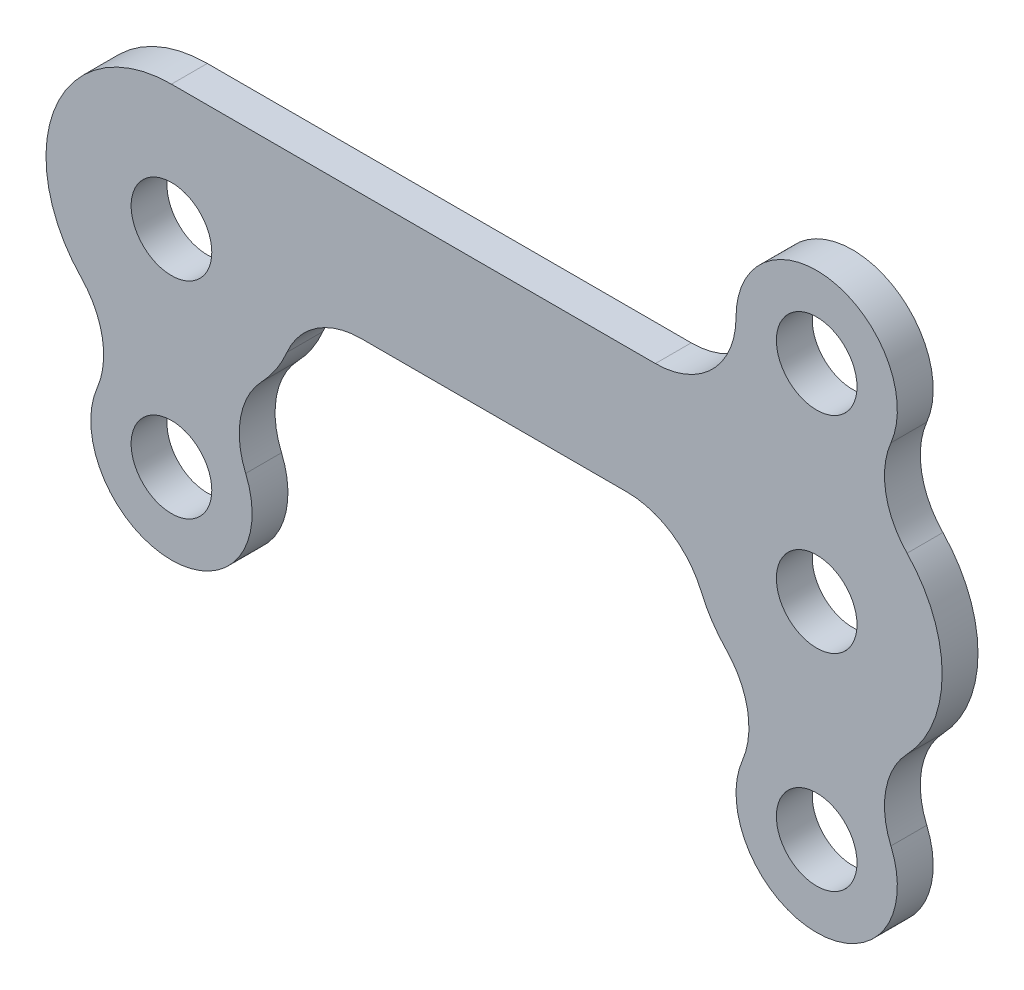
ISO-10303-21;
HEADER;
FILE_DESCRIPTION(('STEP AP214'),'2;1');
FILE_NAME('part.step','',(''),(''),'','','');
FILE_SCHEMA(('AUTOMOTIVE_DESIGN { 1 0 10303 214 1 1 1 1 }'));
ENDSEC;
DATA;
#1=APPLICATION_CONTEXT('core data for automotive mechanical design processes');
#2=APPLICATION_PROTOCOL_DEFINITION('international standard','automotive_design',2000,#1);
#3=PRODUCT_CONTEXT('',#1,'mechanical');
#4=PRODUCT('Part','Part','',(#3));
#5=PRODUCT_RELATED_PRODUCT_CATEGORY('part','',(#4));
#6=PRODUCT_DEFINITION_FORMATION('','',#4);
#7=PRODUCT_DEFINITION_CONTEXT('part definition',#1,'design');
#8=PRODUCT_DEFINITION('design','',#6,#7);
#9=PRODUCT_DEFINITION_SHAPE('','',#8);
#10=(LENGTH_UNIT() NAMED_UNIT(*) SI_UNIT(.MILLI.,.METRE.));
#11=(NAMED_UNIT(*) PLANE_ANGLE_UNIT() SI_UNIT($,.RADIAN.));
#12=(NAMED_UNIT(*) SI_UNIT($,.STERADIAN.) SOLID_ANGLE_UNIT());
#13=UNCERTAINTY_MEASURE_WITH_UNIT(LENGTH_MEASURE(1.E-05),#10,'distance_accuracy_value','');
#14=(GEOMETRIC_REPRESENTATION_CONTEXT(3) GLOBAL_UNCERTAINTY_ASSIGNED_CONTEXT((#13)) GLOBAL_UNIT_ASSIGNED_CONTEXT((#10,
#11,#12)) REPRESENTATION_CONTEXT('',''));
#15=CARTESIAN_POINT('',(0.,0.,0.));
#16=DIRECTION('',(0.,0.,1.));
#17=DIRECTION('',(1.,0.,0.));
#18=AXIS2_PLACEMENT_3D('',#15,#16,#17);
#19=CARTESIAN_POINT('',(35.149116844667,6.33274456521739,1.5875));
#20=DIRECTION('',(0.,0.,-1.));
#21=DIRECTION('',(-1.,0.,0.));
#22=AXIS2_PLACEMENT_3D('',#19,#20,#21);
#23=CYLINDRICAL_SURFACE('',#22,3.571875);
#24=CARTESIAN_POINT('',(35.149116844667,6.33274456521739,0.));
#25=DIRECTION('',(0.,0.,1.));
#26=DIRECTION('',(1.,0.,0.));
#27=AXIS2_PLACEMENT_3D('',#24,#25,#26);
#28=CIRCLE('',#27,3.571875);
#29=CARTESIAN_POINT('',(31.8620584223335,7.73043478260869,0.));
#30=VERTEX_POINT('',#29);
#31=CARTESIAN_POINT('',(32.5766363402321,3.8547140831758,0.));
#32=VERTEX_POINT('',#31);
#33=EDGE_CURVE('E159',#30,#32,#28,.T.);
#34=ORIENTED_EDGE('',*,*,#33,.F.);
#35=DIRECTION('',(0.,0.,-1.));
#36=VECTOR('',#35,1.);
#37=CARTESIAN_POINT('',(31.8620584223335,7.73043478260869,1.5875));
#38=LINE('',#37,#36);
#39=CARTESIAN_POINT('',(31.8620584223335,7.73043478260869,1.5875));
#40=VERTEX_POINT('',#39);
#41=EDGE_CURVE('E154',#40,#30,#38,.T.);
#42=ORIENTED_EDGE('',*,*,#41,.F.);
#43=CARTESIAN_POINT('',(35.149116844667,6.33274456521739,1.5875));
#44=DIRECTION('',(0.,0.,1.));
#45=DIRECTION('',(1.,0.,0.));
#46=AXIS2_PLACEMENT_3D('',#43,#44,#45);
#47=CIRCLE('',#46,3.571875);
#48=CARTESIAN_POINT('',(32.5766363402321,3.8547140831758,1.5875));
#49=VERTEX_POINT('',#48);
#50=EDGE_CURVE('E157',#40,#49,#47,.T.);
#51=ORIENTED_EDGE('',*,*,#50,.T.);
#52=DIRECTION('',(0.,0.,-1.));
#53=VECTOR('',#52,1.);
#54=CARTESIAN_POINT('',(32.5766363402321,3.8547140831758,1.5875));
#55=LINE('',#54,#53);
#56=EDGE_CURVE('E229',#49,#32,#55,.T.);
#57=ORIENTED_EDGE('',*,*,#56,.T.);
#58=EDGE_LOOP('',(#34,#42,#51,#57));
#59=FACE_BOUND('',#58,.T.);
#60=ADVANCED_FACE('F35',(#59),#23,.F.);
#61=CARTESIAN_POINT('',(28.575,9.128125,1.5875));
#62=DIRECTION('',(0.,0.,-1.));
#63=DIRECTION('',(-1.,0.,0.));
#64=AXIS2_PLACEMENT_3D('',#61,#62,#63);
#65=CYLINDRICAL_SURFACE('',#64,3.571875);
#66=CARTESIAN_POINT('',(28.575,9.128125,0.));
#67=DIRECTION('',(0.,0.,1.));
#68=DIRECTION('',(1.,0.,0.));
#69=AXIS2_PLACEMENT_3D('',#66,#67,#68);
#70=CIRCLE('',#69,3.571875);
#71=CARTESIAN_POINT('',(25.003125,9.128125,0.));
#72=VERTEX_POINT('',#71);
#73=EDGE_CURVE('E231',#30,#72,#70,.T.);
#74=ORIENTED_EDGE('',*,*,#73,.T.);
#75=DIRECTION('',(0.,0.,-1.));
#76=VECTOR('',#75,1.);
#77=CARTESIAN_POINT('',(25.003125,9.128125,1.5875));
#78=LINE('',#77,#76);
#79=CARTESIAN_POINT('',(25.003125,9.128125,1.5875));
#80=VERTEX_POINT('',#79);
#81=EDGE_CURVE('E164',#80,#72,#78,.T.);
#82=ORIENTED_EDGE('',*,*,#81,.F.);
#83=CARTESIAN_POINT('',(28.575,9.128125,1.5875));
#84=DIRECTION('',(0.,0.,1.));
#85=DIRECTION('',(1.,0.,0.));
#86=AXIS2_PLACEMENT_3D('',#83,#84,#85);
#87=CIRCLE('',#86,3.571875);
#88=EDGE_CURVE('E167',#40,#80,#87,.T.);
#89=ORIENTED_EDGE('',*,*,#88,.F.);
#90=ORIENTED_EDGE('',*,*,#41,.T.);
#91=EDGE_LOOP('',(#74,#82,#89,#90));
#92=FACE_BOUND('',#91,.T.);
#93=ADVANCED_FACE('F168',(#92),#65,.T.);
#94=CARTESIAN_POINT('',(21.43125,9.128125,1.5875));
#95=DIRECTION('',(0.,0.,-1.));
#96=DIRECTION('',(-1.,0.,0.));
#97=AXIS2_PLACEMENT_3D('',#94,#95,#96);
#98=CYLINDRICAL_SURFACE('',#97,3.571875);
#99=CARTESIAN_POINT('',(21.43125,9.128125,0.));
#100=DIRECTION('',(0.,0.,1.));
#101=DIRECTION('',(1.,0.,0.));
#102=AXIS2_PLACEMENT_3D('',#99,#100,#101);
#103=CIRCLE('',#102,3.571875);
#104=CARTESIAN_POINT('',(21.43125,5.55625,0.));
#105=VERTEX_POINT('',#104);
#106=EDGE_CURVE('E233',#105,#72,#103,.T.);
#107=ORIENTED_EDGE('',*,*,#106,.F.);
#108=DIRECTION('',(0.,0.,-1.));
#109=VECTOR('',#108,1.);
#110=CARTESIAN_POINT('',(21.43125,5.55625,1.5875));
#111=LINE('',#110,#109);
#112=CARTESIAN_POINT('',(21.43125,5.55625,1.5875));
#113=VERTEX_POINT('',#112);
#114=EDGE_CURVE('E298',#113,#105,#111,.T.);
#115=ORIENTED_EDGE('',*,*,#114,.F.);
#116=CARTESIAN_POINT('',(21.43125,9.128125,1.5875));
#117=DIRECTION('',(0.,0.,1.));
#118=DIRECTION('',(1.,0.,0.));
#119=AXIS2_PLACEMENT_3D('',#116,#117,#118);
#120=CIRCLE('',#119,3.571875);
#121=EDGE_CURVE('E172',#113,#80,#120,.T.);
#122=ORIENTED_EDGE('',*,*,#121,.T.);
#123=ORIENTED_EDGE('',*,*,#81,.T.);
#124=EDGE_LOOP('',(#107,#115,#122,#123));
#125=FACE_BOUND('',#124,.T.);
#126=ADVANCED_FACE('F356',(#125),#98,.F.);
#127=CARTESIAN_POINT('',(0.,5.55625,1.5875));
#128=DIRECTION('',(0.,1.,0.));
#129=DIRECTION('',(0.,0.,1.));
#130=AXIS2_PLACEMENT_3D('',#127,#128,#129);
#131=PLANE('',#130);
#132=DIRECTION('',(1.,0.,0.));
#133=VECTOR('',#132,1.);
#134=CARTESIAN_POINT('',(0.,5.55625,0.));
#135=LINE('',#134,#133);
#136=CARTESIAN_POINT('',(0.,5.55625,0.));
#137=VERTEX_POINT('',#136);
#138=EDGE_CURVE('E236',#137,#105,#135,.T.);
#139=ORIENTED_EDGE('',*,*,#138,.F.);
#140=DIRECTION('',(0.,0.,-1.));
#141=VECTOR('',#140,1.);
#142=CARTESIAN_POINT('',(0.,5.55625,1.5875));
#143=LINE('',#142,#141);
#144=CARTESIAN_POINT('',(0.,5.55625,1.5875));
#145=VERTEX_POINT('',#144);
#146=EDGE_CURVE('E296',#145,#137,#143,.T.);
#147=ORIENTED_EDGE('',*,*,#146,.F.);
#148=DIRECTION('',(1.,0.,0.));
#149=VECTOR('',#148,1.);
#150=CARTESIAN_POINT('',(0.,5.55625,1.5875));
#151=LINE('',#150,#149);
#152=EDGE_CURVE('E187',#145,#113,#151,.T.);
#153=ORIENTED_EDGE('',*,*,#152,.T.);
#154=ORIENTED_EDGE('',*,*,#114,.T.);
#155=EDGE_LOOP('',(#139,#147,#153,#154));
#156=FACE_BOUND('',#155,.T.);
#157=ADVANCED_FACE('F352',(#156),#131,.T.);
#158=CARTESIAN_POINT('',(0.,0.,1.5875));
#159=DIRECTION('',(0.,0.,-1.));
#160=DIRECTION('',(-1.,0.,0.));
#161=AXIS2_PLACEMENT_3D('',#158,#159,#160);
#162=CYLINDRICAL_SURFACE('',#161,5.55625);
#163=CARTESIAN_POINT('',(0.,0.,0.));
#164=DIRECTION('',(0.,0.,1.));
#165=DIRECTION('',(1.,0.,0.));
#166=AXIS2_PLACEMENT_3D('',#163,#164,#165);
#167=CIRCLE('',#166,5.55625);
#168=CARTESIAN_POINT('',(-4.0016363402321,-3.8547140831758,0.));
#169=VERTEX_POINT('',#168);
#170=EDGE_CURVE('E239',#137,#169,#167,.T.);
#171=ORIENTED_EDGE('',*,*,#170,.T.);
#172=DIRECTION('',(0.,0.,-1.));
#173=VECTOR('',#172,1.);
#174=CARTESIAN_POINT('',(-4.0016363402321,-3.8547140831758,1.5875));
#175=LINE('',#174,#173);
#176=CARTESIAN_POINT('',(-4.0016363402321,-3.8547140831758,1.5875));
#177=VERTEX_POINT('',#176);
#178=EDGE_CURVE('E294',#177,#169,#175,.T.);
#179=ORIENTED_EDGE('',*,*,#178,.F.);
#180=CARTESIAN_POINT('',(0.,0.,1.5875));
#181=DIRECTION('',(0.,0.,1.));
#182=DIRECTION('',(1.,0.,0.));
#183=AXIS2_PLACEMENT_3D('',#180,#181,#182);
#184=CIRCLE('',#183,5.55625);
#185=EDGE_CURVE('E190',#145,#177,#184,.T.);
#186=ORIENTED_EDGE('',*,*,#185,.F.);
#187=ORIENTED_EDGE('',*,*,#146,.T.);
#188=EDGE_LOOP('',(#171,#179,#186,#187));
#189=FACE_BOUND('',#188,.T.);
#190=ADVANCED_FACE('F349',(#189),#162,.T.);
#191=CARTESIAN_POINT('',(-6.57411684466701,-6.33274456521738,1.5875));
#192=DIRECTION('',(0.,0.,-1.));
#193=DIRECTION('',(-1.,0.,0.));
#194=AXIS2_PLACEMENT_3D('',#191,#192,#193);
#195=CYLINDRICAL_SURFACE('',#194,3.571875);
#196=CARTESIAN_POINT('',(-6.57411684466701,-6.33274456521738,0.));
#197=DIRECTION('',(0.,0.,1.));
#198=DIRECTION('',(1.,0.,0.));
#199=AXIS2_PLACEMENT_3D('',#196,#197,#198);
#200=CIRCLE('',#199,3.571875);
#201=CARTESIAN_POINT('',(-3.28705842233351,-7.73043478260869,0.));
#202=VERTEX_POINT('',#201);
#203=EDGE_CURVE('E242',#202,#169,#200,.T.);
#204=ORIENTED_EDGE('',*,*,#203,.F.);
#205=DIRECTION('',(0.,0.,-1.));
#206=VECTOR('',#205,1.);
#207=CARTESIAN_POINT('',(-3.28705842233351,-7.73043478260869,1.5875));
#208=LINE('',#207,#206);
#209=CARTESIAN_POINT('',(-3.28705842233351,-7.73043478260869,1.5875));
#210=VERTEX_POINT('',#209);
#211=EDGE_CURVE('E292',#210,#202,#208,.T.);
#212=ORIENTED_EDGE('',*,*,#211,.F.);
#213=CARTESIAN_POINT('',(-6.57411684466701,-6.33274456521738,1.5875));
#214=DIRECTION('',(0.,0.,1.));
#215=DIRECTION('',(1.,0.,0.));
#216=AXIS2_PLACEMENT_3D('',#213,#214,#215);
#217=CIRCLE('',#216,3.571875);
#218=EDGE_CURVE('E192',#210,#177,#217,.T.);
#219=ORIENTED_EDGE('',*,*,#218,.T.);
#220=ORIENTED_EDGE('',*,*,#178,.T.);
#221=EDGE_LOOP('',(#204,#212,#219,#220));
#222=FACE_BOUND('',#221,.T.);
#223=ADVANCED_FACE('F344',(#222),#195,.F.);
#224=CARTESIAN_POINT('',(0.,-9.128125,1.5875));
#225=DIRECTION('',(0.,0.,-1.));
#226=DIRECTION('',(-1.,0.,0.));
#227=AXIS2_PLACEMENT_3D('',#224,#225,#226);
#228=CYLINDRICAL_SURFACE('',#227,3.571875);
#229=CARTESIAN_POINT('',(0.,-9.128125,0.));
#230=DIRECTION('',(0.,0.,1.));
#231=DIRECTION('',(1.,0.,0.));
#232=AXIS2_PLACEMENT_3D('',#229,#230,#231);
#233=CIRCLE('',#232,3.571875);
#234=CARTESIAN_POINT('',(3.28705842233351,-7.73043478260869,0.));
#235=VERTEX_POINT('',#234);
#236=EDGE_CURVE('E246',#202,#235,#233,.T.);
#237=ORIENTED_EDGE('',*,*,#236,.T.);
#238=DIRECTION('',(0.,0.,-1.));
#239=VECTOR('',#238,1.);
#240=CARTESIAN_POINT('',(3.28705842233351,-7.73043478260869,1.5875));
#241=LINE('',#240,#239);
#242=CARTESIAN_POINT('',(3.28705842233351,-7.73043478260869,1.5875));
#243=VERTEX_POINT('',#242);
#244=EDGE_CURVE('E290',#243,#235,#241,.T.);
#245=ORIENTED_EDGE('',*,*,#244,.F.);
#246=CARTESIAN_POINT('',(0.,-9.128125,1.5875));
#247=DIRECTION('',(0.,0.,1.));
#248=DIRECTION('',(1.,0.,0.));
#249=AXIS2_PLACEMENT_3D('',#246,#247,#248);
#250=CIRCLE('',#249,3.571875);
#251=EDGE_CURVE('E196',#210,#243,#250,.T.);
#252=ORIENTED_EDGE('',*,*,#251,.F.);
#253=ORIENTED_EDGE('',*,*,#211,.T.);
#254=EDGE_LOOP('',(#237,#245,#252,#253));
#255=FACE_BOUND('',#254,.T.);
#256=ADVANCED_FACE('F340',(#255),#228,.T.);
#257=CARTESIAN_POINT('',(6.57411684466701,-6.33274456521738,1.5875));
#258=DIRECTION('',(0.,0.,-1.));
#259=DIRECTION('',(-1.,0.,0.));
#260=AXIS2_PLACEMENT_3D('',#257,#258,#259);
#261=CYLINDRICAL_SURFACE('',#260,3.571875);
#262=CARTESIAN_POINT('',(6.57411684466701,-6.33274456521738,0.));
#263=DIRECTION('',(0.,0.,1.));
#264=DIRECTION('',(1.,0.,0.));
#265=AXIS2_PLACEMENT_3D('',#262,#263,#264);
#266=CIRCLE('',#265,3.571875);
#267=CARTESIAN_POINT('',(4.0016363402321,-3.8547140831758,0.));
#268=VERTEX_POINT('',#267);
#269=EDGE_CURVE('E249',#268,#235,#266,.T.);
#270=ORIENTED_EDGE('',*,*,#269,.F.);
#271=DIRECTION('',(0.,0.,-1.));
#272=VECTOR('',#271,1.);
#273=CARTESIAN_POINT('',(4.0016363402321,-3.8547140831758,1.5875));
#274=LINE('',#273,#272);
#275=CARTESIAN_POINT('',(4.0016363402321,-3.8547140831758,1.5875));
#276=VERTEX_POINT('',#275);
#277=EDGE_CURVE('E288',#276,#268,#274,.T.);
#278=ORIENTED_EDGE('',*,*,#277,.F.);
#279=CARTESIAN_POINT('',(6.57411684466701,-6.33274456521738,1.5875));
#280=DIRECTION('',(0.,0.,1.));
#281=DIRECTION('',(1.,0.,0.));
#282=AXIS2_PLACEMENT_3D('',#279,#280,#281);
#283=CIRCLE('',#282,3.571875);
#284=EDGE_CURVE('E198',#276,#243,#283,.T.);
#285=ORIENTED_EDGE('',*,*,#284,.T.);
#286=ORIENTED_EDGE('',*,*,#244,.T.);
#287=EDGE_LOOP('',(#270,#278,#285,#286));
#288=FACE_BOUND('',#287,.T.);
#289=ADVANCED_FACE('F336',(#288),#261,.F.);
#290=CARTESIAN_POINT('',(5.11320199029657,-2.1741847826087,0.));
#291=VERTEX_POINT('',#290);
#292=EDGE_CURVE('E243',#268,#291,#167,.T.);
#293=ORIENTED_EDGE('',*,*,#292,.T.);
#294=DIRECTION('',(0.,0.,-1.));
#295=VECTOR('',#294,1.);
#296=CARTESIAN_POINT('',(5.11320199029657,-2.1741847826087,1.5875));
#297=LINE('',#296,#295);
#298=CARTESIAN_POINT('',(5.11320199029657,-2.1741847826087,1.5875));
#299=VERTEX_POINT('',#298);
#300=EDGE_CURVE('E50',#291,#299,#297,.F.);
#301=ORIENTED_EDGE('',*,*,#300,.T.);
#302=EDGE_CURVE('E193',#276,#299,#184,.T.);
#303=ORIENTED_EDGE('',*,*,#302,.F.);
#304=ORIENTED_EDGE('',*,*,#277,.T.);
#305=EDGE_LOOP('',(#293,#301,#303,#304));
#306=FACE_BOUND('',#305,.T.);
#307=ADVANCED_FACE('F332',(#306),#162,.T.);
#308=CARTESIAN_POINT('',(0.,0.,1.5875));
#309=DIRECTION('',(0.,1.,0.));
#310=DIRECTION('',(0.,0.,1.));
#311=AXIS2_PLACEMENT_3D('',#308,#309,#310);
#312=PLANE('',#311);
#313=DIRECTION('',(1.,0.,0.));
#314=VECTOR('',#313,1.);
#315=CARTESIAN_POINT('',(0.,0.,0.));
#316=LINE('',#315,#314);
#317=CARTESIAN_POINT('',(8.40026041263007,0.,0.));
#318=VERTEX_POINT('',#317);
#319=CARTESIAN_POINT('',(20.1747395873699,0.,0.));
#320=VERTEX_POINT('',#319);
#321=EDGE_CURVE('E252',#318,#320,#316,.T.);
#322=ORIENTED_EDGE('',*,*,#321,.T.);
#323=DIRECTION('',(0.,0.,1.));
#324=VECTOR('',#323,1.);
#325=CARTESIAN_POINT('',(20.1747395873699,0.,1.5875));
#326=LINE('',#325,#324);
#327=CARTESIAN_POINT('',(20.1747395873699,0.,1.5875));
#328=VERTEX_POINT('',#327);
#329=EDGE_CURVE('E306',#320,#328,#326,.T.);
#330=ORIENTED_EDGE('',*,*,#329,.T.);
#331=DIRECTION('',(1.,0.,0.));
#332=VECTOR('',#331,1.);
#333=CARTESIAN_POINT('',(0.,0.,1.5875));
#334=LINE('',#333,#332);
#335=CARTESIAN_POINT('',(8.40026041263007,0.,1.5875));
#336=VERTEX_POINT('',#335);
#337=EDGE_CURVE('E201',#336,#328,#334,.T.);
#338=ORIENTED_EDGE('',*,*,#337,.F.);
#339=DIRECTION('',(0.,0.,1.));
#340=VECTOR('',#339,1.);
#341=CARTESIAN_POINT('',(8.40026041263007,0.,0.));
#342=LINE('',#341,#340);
#343=EDGE_CURVE('E303',#336,#318,#342,.F.);
#344=ORIENTED_EDGE('',*,*,#343,.T.);
#345=EDGE_LOOP('',(#322,#330,#338,#344));
#346=FACE_BOUND('',#345,.T.);
#347=ADVANCED_FACE('F327',(#346),#312,.F.);
#348=CARTESIAN_POINT('',(28.575,0.,1.5875));
#349=DIRECTION('',(0.,0.,-1.));
#350=DIRECTION('',(-1.,0.,0.));
#351=AXIS2_PLACEMENT_3D('',#348,#349,#350);
#352=CYLINDRICAL_SURFACE('',#351,5.55625);
#353=CARTESIAN_POINT('',(28.575,0.,1.5875));
#354=DIRECTION('',(0.,0.,1.));
#355=DIRECTION('',(1.,0.,0.));
#356=AXIS2_PLACEMENT_3D('',#353,#354,#355);
#357=CIRCLE('',#356,5.55625);
#358=CARTESIAN_POINT('',(23.4617980097034,-2.1741847826087,1.5875));
#359=VERTEX_POINT('',#358);
#360=CARTESIAN_POINT('',(24.5733636597679,-3.8547140831758,1.5875));
#361=VERTEX_POINT('',#360);
#362=EDGE_CURVE('E204',#359,#361,#357,.T.);
#363=ORIENTED_EDGE('',*,*,#362,.F.);
#364=DIRECTION('',(0.,0.,-1.));
#365=VECTOR('',#364,1.);
#366=CARTESIAN_POINT('',(23.4617980097034,-2.1741847826087,1.5875));
#367=LINE('',#366,#365);
#368=CARTESIAN_POINT('',(23.4617980097034,-2.1741847826087,0.));
#369=VERTEX_POINT('',#368);
#370=EDGE_CURVE('E163',#359,#369,#367,.T.);
#371=ORIENTED_EDGE('',*,*,#370,.T.);
#372=CARTESIAN_POINT('',(28.575,0.,0.));
#373=DIRECTION('',(0.,0.,1.));
#374=DIRECTION('',(1.,0.,0.));
#375=AXIS2_PLACEMENT_3D('',#372,#373,#374);
#376=CIRCLE('',#375,5.55625);
#377=CARTESIAN_POINT('',(24.5733636597679,-3.8547140831758,0.));
#378=VERTEX_POINT('',#377);
#379=EDGE_CURVE('E255',#369,#378,#376,.T.);
#380=ORIENTED_EDGE('',*,*,#379,.T.);
#381=DIRECTION('',(0.,0.,-1.));
#382=VECTOR('',#381,1.);
#383=CARTESIAN_POINT('',(24.5733636597679,-3.8547140831758,1.5875));
#384=LINE('',#383,#382);
#385=EDGE_CURVE('E285',#361,#378,#384,.T.);
#386=ORIENTED_EDGE('',*,*,#385,.F.);
#387=EDGE_LOOP('',(#363,#371,#380,#386));
#388=FACE_BOUND('',#387,.T.);
#389=ADVANCED_FACE('F321',(#388),#352,.T.);
#390=CARTESIAN_POINT('',(22.000883155333,-6.33274456521739,1.5875));
#391=DIRECTION('',(0.,0.,-1.));
#392=DIRECTION('',(-1.,0.,0.));
#393=AXIS2_PLACEMENT_3D('',#390,#391,#392);
#394=CYLINDRICAL_SURFACE('',#393,3.571875);
#395=CARTESIAN_POINT('',(22.000883155333,-6.33274456521739,0.));
#396=DIRECTION('',(0.,0.,1.));
#397=DIRECTION('',(1.,0.,0.));
#398=AXIS2_PLACEMENT_3D('',#395,#396,#397);
#399=CIRCLE('',#398,3.571875);
#400=CARTESIAN_POINT('',(25.2879415776665,-7.7304347826087,0.));
#401=VERTEX_POINT('',#400);
#402=EDGE_CURVE('E257',#401,#378,#399,.T.);
#403=ORIENTED_EDGE('',*,*,#402,.F.);
#404=DIRECTION('',(0.,0.,-1.));
#405=VECTOR('',#404,1.);
#406=CARTESIAN_POINT('',(25.2879415776665,-7.7304347826087,1.5875));
#407=LINE('',#406,#405);
#408=CARTESIAN_POINT('',(25.2879415776665,-7.7304347826087,1.5875));
#409=VERTEX_POINT('',#408);
#410=EDGE_CURVE('E283',#409,#401,#407,.T.);
#411=ORIENTED_EDGE('',*,*,#410,.F.);
#412=CARTESIAN_POINT('',(22.000883155333,-6.33274456521739,1.5875));
#413=DIRECTION('',(0.,0.,1.));
#414=DIRECTION('',(1.,0.,0.));
#415=AXIS2_PLACEMENT_3D('',#412,#413,#414);
#416=CIRCLE('',#415,3.571875);
#417=EDGE_CURVE('E206',#409,#361,#416,.T.);
#418=ORIENTED_EDGE('',*,*,#417,.T.);
#419=ORIENTED_EDGE('',*,*,#385,.T.);
#420=EDGE_LOOP('',(#403,#411,#418,#419));
#421=FACE_BOUND('',#420,.T.);
#422=ADVANCED_FACE('F370',(#421),#394,.F.);
#423=CARTESIAN_POINT('',(28.575,-9.128125,1.5875));
#424=DIRECTION('',(0.,0.,-1.));
#425=DIRECTION('',(-1.,0.,0.));
#426=AXIS2_PLACEMENT_3D('',#423,#424,#425);
#427=CYLINDRICAL_SURFACE('',#426,3.57187499999999);
#428=CARTESIAN_POINT('',(28.575,-9.128125,0.));
#429=DIRECTION('',(0.,0.,1.));
#430=DIRECTION('',(1.,0.,0.));
#431=AXIS2_PLACEMENT_3D('',#428,#429,#430);
#432=CIRCLE('',#431,3.57187499999999);
#433=CARTESIAN_POINT('',(31.8620584223335,-7.73043478260869,0.));
#434=VERTEX_POINT('',#433);
#435=EDGE_CURVE('E261',#401,#434,#432,.T.);
#436=ORIENTED_EDGE('',*,*,#435,.T.);
#437=DIRECTION('',(0.,0.,-1.));
#438=VECTOR('',#437,1.);
#439=CARTESIAN_POINT('',(31.8620584223335,-7.73043478260869,1.5875));
#440=LINE('',#439,#438);
#441=CARTESIAN_POINT('',(31.8620584223335,-7.73043478260869,1.5875));
#442=VERTEX_POINT('',#441);
#443=EDGE_CURVE('E281',#442,#434,#440,.T.);
#444=ORIENTED_EDGE('',*,*,#443,.F.);
#445=CARTESIAN_POINT('',(28.575,-9.128125,1.5875));
#446=DIRECTION('',(0.,0.,1.));
#447=DIRECTION('',(1.,0.,0.));
#448=AXIS2_PLACEMENT_3D('',#445,#446,#447);
#449=CIRCLE('',#448,3.57187499999999);
#450=EDGE_CURVE('E209',#409,#442,#449,.T.);
#451=ORIENTED_EDGE('',*,*,#450,.F.);
#452=ORIENTED_EDGE('',*,*,#410,.T.);
#453=EDGE_LOOP('',(#436,#444,#451,#452));
#454=FACE_BOUND('',#453,.T.);
#455=ADVANCED_FACE('F367',(#454),#427,.T.);
#456=CARTESIAN_POINT('',(35.149116844667,-6.33274456521738,1.5875));
#457=DIRECTION('',(0.,0.,-1.));
#458=DIRECTION('',(-1.,0.,0.));
#459=AXIS2_PLACEMENT_3D('',#456,#457,#458);
#460=CYLINDRICAL_SURFACE('',#459,3.571875);
#461=CARTESIAN_POINT('',(35.149116844667,-6.33274456521738,0.));
#462=DIRECTION('',(0.,0.,1.));
#463=DIRECTION('',(1.,0.,0.));
#464=AXIS2_PLACEMENT_3D('',#461,#462,#463);
#465=CIRCLE('',#464,3.571875);
#466=CARTESIAN_POINT('',(32.5766363402321,-3.8547140831758,0.));
#467=VERTEX_POINT('',#466);
#468=EDGE_CURVE('E264',#467,#434,#465,.T.);
#469=ORIENTED_EDGE('',*,*,#468,.F.);
#470=DIRECTION('',(0.,0.,-1.));
#471=VECTOR('',#470,1.);
#472=CARTESIAN_POINT('',(32.5766363402321,-3.8547140831758,1.5875));
#473=LINE('',#472,#471);
#474=CARTESIAN_POINT('',(32.5766363402321,-3.8547140831758,1.5875));
#475=VERTEX_POINT('',#474);
#476=EDGE_CURVE('E279',#475,#467,#473,.T.);
#477=ORIENTED_EDGE('',*,*,#476,.F.);
#478=CARTESIAN_POINT('',(35.149116844667,-6.33274456521738,1.5875));
#479=DIRECTION('',(0.,0.,1.));
#480=DIRECTION('',(1.,0.,0.));
#481=AXIS2_PLACEMENT_3D('',#478,#479,#480);
#482=CIRCLE('',#481,3.571875);
#483=EDGE_CURVE('E211',#475,#442,#482,.T.);
#484=ORIENTED_EDGE('',*,*,#483,.T.);
#485=ORIENTED_EDGE('',*,*,#443,.T.);
#486=EDGE_LOOP('',(#469,#477,#484,#485));
#487=FACE_BOUND('',#486,.T.);
#488=ADVANCED_FACE('F363',(#487),#460,.F.);
#489=CARTESIAN_POINT('',(28.575,9.128125,1.5875));
#490=DIRECTION('',(0.,0.,-1.));
#491=DIRECTION('',(-1.,0.,0.));
#492=AXIS2_PLACEMENT_3D('',#489,#490,#491);
#493=CYLINDRICAL_SURFACE('',#492,1.7859375);
#494=CARTESIAN_POINT('',(28.575,9.128125,1.5875));
#495=DIRECTION('',(0.,0.,1.));
#496=DIRECTION('',(1.,0.,0.));
#497=AXIS2_PLACEMENT_3D('',#494,#495,#496);
#498=CIRCLE('',#497,1.7859375);
#499=CARTESIAN_POINT('',(30.3609375,9.128125,1.5875));
#500=VERTEX_POINT('',#499);
#501=EDGE_CURVE('E223',#500,#500,#498,.T.);
#502=ORIENTED_EDGE('',*,*,#501,.T.);
#503=EDGE_LOOP('',(#502));
#504=FACE_BOUND('',#503,.T.);
#505=CARTESIAN_POINT('',(28.575,9.128125,0.));
#506=DIRECTION('',(0.,0.,1.));
#507=DIRECTION('',(1.,0.,0.));
#508=AXIS2_PLACEMENT_3D('',#505,#506,#507);
#509=CIRCLE('',#508,1.7859375);
#510=CARTESIAN_POINT('',(30.3609375,9.128125,0.));
#511=VERTEX_POINT('',#510);
#512=EDGE_CURVE('E183',#511,#511,#509,.T.);
#513=ORIENTED_EDGE('',*,*,#512,.F.);
#514=EDGE_LOOP('',(#513));
#515=FACE_BOUND('',#514,.T.);
#516=ADVANCED_FACE('F403',(#504,#515),#493,.F.);
#517=CARTESIAN_POINT('',(0.,-9.128125,1.5875));
#518=DIRECTION('',(0.,0.,-1.));
#519=DIRECTION('',(-1.,0.,0.));
#520=AXIS2_PLACEMENT_3D('',#517,#518,#519);
#521=CYLINDRICAL_SURFACE('',#520,1.7859375);
#522=CARTESIAN_POINT('',(0.,-9.128125,1.5875));
#523=DIRECTION('',(0.,0.,1.));
#524=DIRECTION('',(1.,0.,0.));
#525=AXIS2_PLACEMENT_3D('',#522,#523,#524);
#526=CIRCLE('',#525,1.7859375);
#527=CARTESIAN_POINT('',(1.7859375,-9.128125,1.5875));
#528=VERTEX_POINT('',#527);
#529=EDGE_CURVE('E220',#528,#528,#526,.T.);
#530=ORIENTED_EDGE('',*,*,#529,.T.);
#531=EDGE_LOOP('',(#530));
#532=FACE_BOUND('',#531,.T.);
#533=CARTESIAN_POINT('',(0.,-9.128125,0.));
#534=DIRECTION('',(0.,0.,1.));
#535=DIRECTION('',(1.,0.,0.));
#536=AXIS2_PLACEMENT_3D('',#533,#534,#535);
#537=CIRCLE('',#536,1.7859375);
#538=CARTESIAN_POINT('',(1.7859375,-9.128125,0.));
#539=VERTEX_POINT('',#538);
#540=EDGE_CURVE('E273',#539,#539,#537,.T.);
#541=ORIENTED_EDGE('',*,*,#540,.F.);
#542=EDGE_LOOP('',(#541));
#543=FACE_BOUND('',#542,.T.);
#544=ADVANCED_FACE('F406',(#532,#543),#521,.F.);
#545=CARTESIAN_POINT('',(28.575,0.,1.5875));
#546=DIRECTION('',(0.,0.,-1.));
#547=DIRECTION('',(-1.,0.,0.));
#548=AXIS2_PLACEMENT_3D('',#545,#546,#547);
#549=CYLINDRICAL_SURFACE('',#548,1.7859375);
#550=CARTESIAN_POINT('',(28.575,0.,1.5875));
#551=DIRECTION('',(0.,0.,1.));
#552=DIRECTION('',(1.,0.,0.));
#553=AXIS2_PLACEMENT_3D('',#550,#551,#552);
#554=CIRCLE('',#553,1.7859375);
#555=CARTESIAN_POINT('',(30.3609375,0.,1.5875));
#556=VERTEX_POINT('',#555);
#557=EDGE_CURVE('E217',#556,#556,#554,.T.);
#558=ORIENTED_EDGE('',*,*,#557,.T.);
#559=EDGE_LOOP('',(#558));
#560=FACE_BOUND('',#559,.T.);
#561=CARTESIAN_POINT('',(28.575,0.,0.));
#562=DIRECTION('',(0.,0.,1.));
#563=DIRECTION('',(1.,0.,0.));
#564=AXIS2_PLACEMENT_3D('',#561,#562,#563);
#565=CIRCLE('',#564,1.7859375);
#566=CARTESIAN_POINT('',(30.3609375,0.,0.));
#567=VERTEX_POINT('',#566);
#568=EDGE_CURVE('E270',#567,#567,#565,.T.);
#569=ORIENTED_EDGE('',*,*,#568,.F.);
#570=EDGE_LOOP('',(#569));
#571=FACE_BOUND('',#570,.T.);
#572=ADVANCED_FACE('F410',(#560,#571),#549,.F.);
#573=CARTESIAN_POINT('',(0.,0.,1.5875));
#574=DIRECTION('',(0.,0.,-1.));
#575=DIRECTION('',(-1.,0.,0.));
#576=AXIS2_PLACEMENT_3D('',#573,#574,#575);
#577=CYLINDRICAL_SURFACE('',#576,1.7859375);
#578=CARTESIAN_POINT('',(0.,0.,1.5875));
#579=DIRECTION('',(0.,0.,1.));
#580=DIRECTION('',(1.,0.,0.));
#581=AXIS2_PLACEMENT_3D('',#578,#579,#580);
#582=CIRCLE('',#581,1.7859375);
#583=CARTESIAN_POINT('',(1.7859375,0.,1.5875));
#584=VERTEX_POINT('',#583);
#585=EDGE_CURVE('E214',#584,#584,#582,.T.);
#586=ORIENTED_EDGE('',*,*,#585,.T.);
#587=EDGE_LOOP('',(#586));
#588=FACE_BOUND('',#587,.T.);
#589=CARTESIAN_POINT('',(0.,0.,0.));
#590=DIRECTION('',(0.,0.,1.));
#591=DIRECTION('',(1.,0.,0.));
#592=AXIS2_PLACEMENT_3D('',#589,#590,#591);
#593=CIRCLE('',#592,1.7859375);
#594=CARTESIAN_POINT('',(1.7859375,0.,0.));
#595=VERTEX_POINT('',#594);
#596=EDGE_CURVE('E267',#595,#595,#593,.T.);
#597=ORIENTED_EDGE('',*,*,#596,.F.);
#598=EDGE_LOOP('',(#597));
#599=FACE_BOUND('',#598,.T.);
#600=ADVANCED_FACE('F414',(#588,#599),#577,.F.);
#601=EDGE_CURVE('E258',#467,#32,#376,.T.);
#602=ORIENTED_EDGE('',*,*,#601,.T.);
#603=ORIENTED_EDGE('',*,*,#56,.F.);
#604=EDGE_CURVE('E178',#475,#49,#357,.T.);
#605=ORIENTED_EDGE('',*,*,#604,.F.);
#606=ORIENTED_EDGE('',*,*,#476,.T.);
#607=EDGE_LOOP('',(#602,#603,#605,#606));
#608=FACE_BOUND('',#607,.T.);
#609=ADVANCED_FACE('F379',(#608),#352,.T.);
#610=CARTESIAN_POINT('',(28.575,-9.128125,1.5875));
#611=DIRECTION('',(0.,0.,-1.));
#612=DIRECTION('',(-1.,0.,0.));
#613=AXIS2_PLACEMENT_3D('',#610,#611,#612);
#614=CYLINDRICAL_SURFACE('',#613,1.7859375);
#615=CARTESIAN_POINT('',(28.575,-9.128125,1.5875));
#616=DIRECTION('',(0.,0.,1.));
#617=DIRECTION('',(1.,0.,0.));
#618=AXIS2_PLACEMENT_3D('',#615,#616,#617);
#619=CIRCLE('',#618,1.7859375);
#620=CARTESIAN_POINT('',(30.3609375,-9.128125,1.5875));
#621=VERTEX_POINT('',#620);
#622=EDGE_CURVE('E226',#621,#621,#619,.T.);
#623=ORIENTED_EDGE('',*,*,#622,.T.);
#624=EDGE_LOOP('',(#623));
#625=FACE_BOUND('',#624,.T.);
#626=CARTESIAN_POINT('',(28.575,-9.128125,0.));
#627=DIRECTION('',(0.,0.,1.));
#628=DIRECTION('',(1.,0.,0.));
#629=AXIS2_PLACEMENT_3D('',#626,#627,#628);
#630=CIRCLE('',#629,1.7859375);
#631=CARTESIAN_POINT('',(30.3609375,-9.128125,0.));
#632=VERTEX_POINT('',#631);
#633=EDGE_CURVE('E180',#632,#632,#630,.T.);
#634=ORIENTED_EDGE('',*,*,#633,.F.);
#635=EDGE_LOOP('',(#634));
#636=FACE_BOUND('',#635,.T.);
#637=ADVANCED_FACE('F397',(#625,#636),#614,.F.);
#638=CARTESIAN_POINT('',(0.,0.,1.5875));
#639=DIRECTION('',(0.,0.,1.));
#640=DIRECTION('',(1.,0.,0.));
#641=AXIS2_PLACEMENT_3D('',#638,#639,#640);
#642=PLANE('',#641);
#643=ORIENTED_EDGE('',*,*,#50,.F.);
#644=ORIENTED_EDGE('',*,*,#88,.T.);
#645=ORIENTED_EDGE('',*,*,#121,.F.);
#646=ORIENTED_EDGE('',*,*,#152,.F.);
#647=ORIENTED_EDGE('',*,*,#185,.T.);
#648=ORIENTED_EDGE('',*,*,#218,.F.);
#649=ORIENTED_EDGE('',*,*,#251,.T.);
#650=ORIENTED_EDGE('',*,*,#284,.F.);
#651=ORIENTED_EDGE('',*,*,#302,.T.);
#652=CARTESIAN_POINT('',(8.40026041263007,-3.571875,1.5875));
#653=DIRECTION('',(0.,0.,1.));
#654=DIRECTION('',(1.,0.,0.));
#655=AXIS2_PLACEMENT_3D('',#652,#653,#654);
#656=CIRCLE('',#655,3.571875);
#657=EDGE_CURVE('E11',#299,#336,#656,.F.);
#658=ORIENTED_EDGE('',*,*,#657,.T.);
#659=ORIENTED_EDGE('',*,*,#337,.T.);
#660=CARTESIAN_POINT('',(20.1747395873699,-3.571875,1.5875));
#661=DIRECTION('',(0.,0.,1.));
#662=DIRECTION('',(1.,0.,0.));
#663=AXIS2_PLACEMENT_3D('',#660,#661,#662);
#664=CIRCLE('',#663,3.571875);
#665=EDGE_CURVE('E311',#328,#359,#664,.F.);
#666=ORIENTED_EDGE('',*,*,#665,.T.);
#667=ORIENTED_EDGE('',*,*,#362,.T.);
#668=ORIENTED_EDGE('',*,*,#417,.F.);
#669=ORIENTED_EDGE('',*,*,#450,.T.);
#670=ORIENTED_EDGE('',*,*,#483,.F.);
#671=ORIENTED_EDGE('',*,*,#604,.T.);
#672=EDGE_LOOP('',(#643,#644,#645,#646,#647,#648,#649,#650,#651,#658,#659,#666,#667,#668,#669,
#670,#671));
#673=FACE_BOUND('',#672,.T.);
#674=ORIENTED_EDGE('',*,*,#585,.F.);
#675=EDGE_LOOP('',(#674));
#676=FACE_BOUND('',#675,.T.);
#677=ORIENTED_EDGE('',*,*,#557,.F.);
#678=EDGE_LOOP('',(#677));
#679=FACE_BOUND('',#678,.T.);
#680=ORIENTED_EDGE('',*,*,#529,.F.);
#681=EDGE_LOOP('',(#680));
#682=FACE_BOUND('',#681,.T.);
#683=ORIENTED_EDGE('',*,*,#501,.F.);
#684=EDGE_LOOP('',(#683));
#685=FACE_BOUND('',#684,.T.);
#686=ORIENTED_EDGE('',*,*,#622,.F.);
#687=EDGE_LOOP('',(#686));
#688=FACE_BOUND('',#687,.T.);
#689=ADVANCED_FACE('F174',(#673,#676,#679,#682,#685,#688),#642,.T.);
#690=CARTESIAN_POINT('',(0.,0.,0.));
#691=DIRECTION('',(0.,0.,1.));
#692=DIRECTION('',(1.,0.,0.));
#693=AXIS2_PLACEMENT_3D('',#690,#691,#692);
#694=PLANE('',#693);
#695=ORIENTED_EDGE('',*,*,#33,.T.);
#696=ORIENTED_EDGE('',*,*,#601,.F.);
#697=ORIENTED_EDGE('',*,*,#468,.T.);
#698=ORIENTED_EDGE('',*,*,#435,.F.);
#699=ORIENTED_EDGE('',*,*,#402,.T.);
#700=ORIENTED_EDGE('',*,*,#379,.F.);
#701=CARTESIAN_POINT('',(20.1747395873699,-3.571875,0.));
#702=DIRECTION('',(0.,0.,1.));
#703=DIRECTION('',(1.,0.,0.));
#704=AXIS2_PLACEMENT_3D('',#701,#702,#703);
#705=CIRCLE('',#704,3.571875);
#706=EDGE_CURVE('E309',#369,#320,#705,.T.);
#707=ORIENTED_EDGE('',*,*,#706,.T.);
#708=ORIENTED_EDGE('',*,*,#321,.F.);
#709=CARTESIAN_POINT('',(8.40026041263007,-3.571875,0.));
#710=DIRECTION('',(0.,0.,1.));
#711=DIRECTION('',(1.,0.,0.));
#712=AXIS2_PLACEMENT_3D('',#709,#710,#711);
#713=CIRCLE('',#712,3.571875);
#714=EDGE_CURVE('E43',#318,#291,#713,.T.);
#715=ORIENTED_EDGE('',*,*,#714,.T.);
#716=ORIENTED_EDGE('',*,*,#292,.F.);
#717=ORIENTED_EDGE('',*,*,#269,.T.);
#718=ORIENTED_EDGE('',*,*,#236,.F.);
#719=ORIENTED_EDGE('',*,*,#203,.T.);
#720=ORIENTED_EDGE('',*,*,#170,.F.);
#721=ORIENTED_EDGE('',*,*,#138,.T.);
#722=ORIENTED_EDGE('',*,*,#106,.T.);
#723=ORIENTED_EDGE('',*,*,#73,.F.);
#724=EDGE_LOOP('',(#695,#696,#697,#698,#699,#700,#707,#708,#715,#716,#717,#718,#719,#720,#721,
#722,#723));
#725=FACE_BOUND('',#724,.T.);
#726=ORIENTED_EDGE('',*,*,#596,.T.);
#727=EDGE_LOOP('',(#726));
#728=FACE_BOUND('',#727,.T.);
#729=ORIENTED_EDGE('',*,*,#568,.T.);
#730=EDGE_LOOP('',(#729));
#731=FACE_BOUND('',#730,.T.);
#732=ORIENTED_EDGE('',*,*,#540,.T.);
#733=EDGE_LOOP('',(#732));
#734=FACE_BOUND('',#733,.T.);
#735=ORIENTED_EDGE('',*,*,#512,.T.);
#736=EDGE_LOOP('',(#735));
#737=FACE_BOUND('',#736,.T.);
#738=ORIENTED_EDGE('',*,*,#633,.T.);
#739=EDGE_LOOP('',(#738));
#740=FACE_BOUND('',#739,.T.);
#741=ADVANCED_FACE('F324',(#725,#728,#731,#734,#737,#740),#694,.F.);
#742=CARTESIAN_POINT('',(20.1747395873699,-3.571875,1.5875));
#743=DIRECTION('',(0.,0.,-1.));
#744=DIRECTION('',(-1.,0.,0.));
#745=AXIS2_PLACEMENT_3D('',#742,#743,#744);
#746=CYLINDRICAL_SURFACE('',#745,3.571875);
#747=ORIENTED_EDGE('',*,*,#665,.F.);
#748=ORIENTED_EDGE('',*,*,#329,.F.);
#749=ORIENTED_EDGE('',*,*,#706,.F.);
#750=ORIENTED_EDGE('',*,*,#370,.F.);
#751=EDGE_LOOP('',(#747,#748,#749,#750));
#752=FACE_BOUND('',#751,.T.);
#753=ADVANCED_FACE('F323',(#752),#746,.F.);
#754=CARTESIAN_POINT('',(8.40026041263007,-3.571875,1.5875));
#755=DIRECTION('',(0.,0.,-1.));
#756=DIRECTION('',(-1.,0.,0.));
#757=AXIS2_PLACEMENT_3D('',#754,#755,#756);
#758=CYLINDRICAL_SURFACE('',#757,3.571875);
#759=ORIENTED_EDGE('',*,*,#657,.F.);
#760=ORIENTED_EDGE('',*,*,#300,.F.);
#761=ORIENTED_EDGE('',*,*,#714,.F.);
#762=ORIENTED_EDGE('',*,*,#343,.F.);
#763=EDGE_LOOP('',(#759,#760,#761,#762));
#764=FACE_BOUND('',#763,.T.);
#765=ADVANCED_FACE('F37',(#764),#758,.F.);
#766=CLOSED_SHELL('',(#60,#93,#126,#157,#190,#223,#256,#289,#307,#347,#389,#422,#455,#488,#516,
#544,#572,#600,#609,#637,#689,#741,#753,#765));
#767=MANIFOLD_SOLID_BREP('B2',#766);
#768=ADVANCED_BREP_SHAPE_REPRESENTATION('',(#18,#767),#14);
#769=SHAPE_DEFINITION_REPRESENTATION(#9,#768);
ENDSEC;
END-ISO-10303-21;
